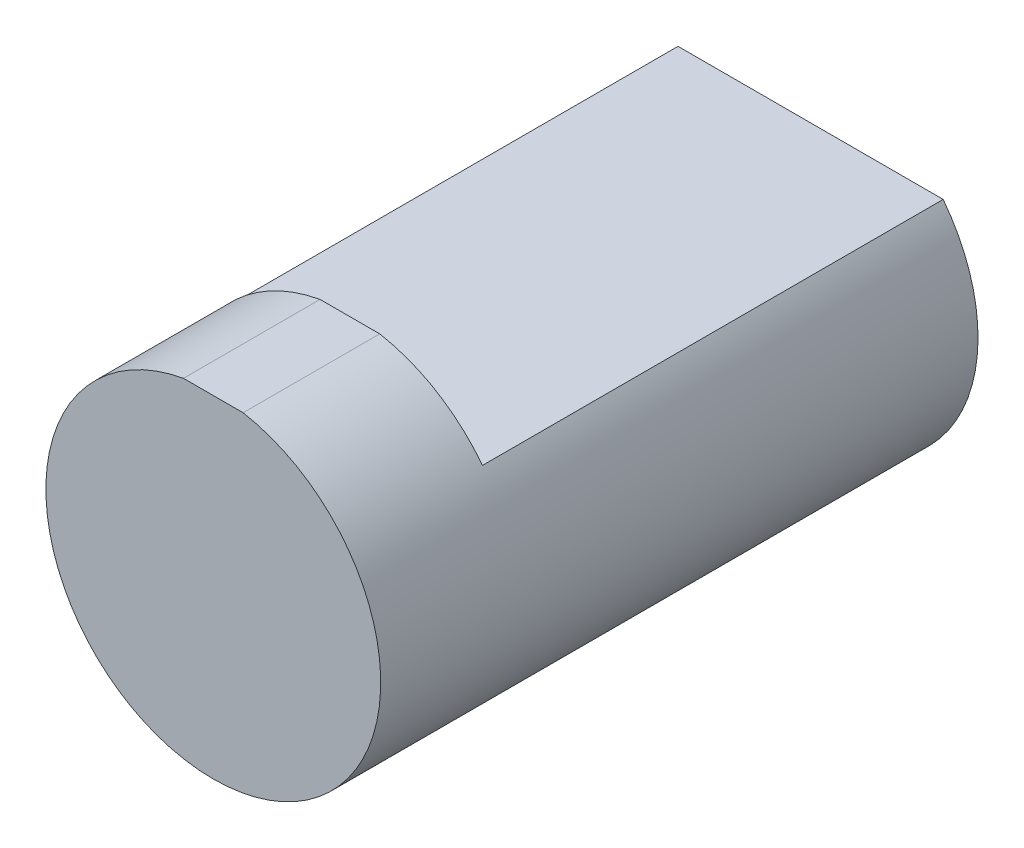
ISO-10303-21;
HEADER;
FILE_DESCRIPTION(('STEP AP214'),'2;1');
FILE_NAME('part.step','',(''),(''),'','','');
FILE_SCHEMA(('AUTOMOTIVE_DESIGN { 1 0 10303 214 1 1 1 1 }'));
ENDSEC;
DATA;
#1=APPLICATION_CONTEXT('core data for automotive mechanical design processes');
#2=APPLICATION_PROTOCOL_DEFINITION('international standard','automotive_design',2000,#1);
#3=PRODUCT_CONTEXT('',#1,'mechanical');
#4=PRODUCT('Part','Part','',(#3));
#5=PRODUCT_RELATED_PRODUCT_CATEGORY('part','',(#4));
#6=PRODUCT_DEFINITION_FORMATION('','',#4);
#7=PRODUCT_DEFINITION_CONTEXT('part definition',#1,'design');
#8=PRODUCT_DEFINITION('design','',#6,#7);
#9=PRODUCT_DEFINITION_SHAPE('','',#8);
#10=(LENGTH_UNIT() NAMED_UNIT(*) SI_UNIT(.MILLI.,.METRE.));
#11=(NAMED_UNIT(*) PLANE_ANGLE_UNIT() SI_UNIT($,.RADIAN.));
#12=(NAMED_UNIT(*) SI_UNIT($,.STERADIAN.) SOLID_ANGLE_UNIT());
#13=UNCERTAINTY_MEASURE_WITH_UNIT(LENGTH_MEASURE(1.E-05),#10,'distance_accuracy_value','');
#14=(GEOMETRIC_REPRESENTATION_CONTEXT(3) GLOBAL_UNCERTAINTY_ASSIGNED_CONTEXT((#13)) GLOBAL_UNIT_ASSIGNED_CONTEXT((#10,
#11,#12)) REPRESENTATION_CONTEXT('',''));
#15=CARTESIAN_POINT('',(0.,0.,0.));
#16=DIRECTION('',(0.,0.,1.));
#17=DIRECTION('',(1.,0.,0.));
#18=AXIS2_PLACEMENT_3D('',#15,#16,#17);
#19=CARTESIAN_POINT('',(0.,0.,223.));
#20=DIRECTION('',(0.,0.,-1.));
#21=DIRECTION('',(-1.,0.,0.));
#22=AXIS2_PLACEMENT_3D('',#19,#20,#21);
#23=CYLINDRICAL_SURFACE('',#22,62.5);
#24=DIRECTION('',(0.,0.,-1.));
#25=VECTOR('',#24,1.);
#26=CARTESIAN_POINT('',(11.1355287256601,61.5,223.));
#27=LINE('',#26,#25);
#28=CARTESIAN_POINT('',(11.1355287256601,61.5,223.));
#29=VERTEX_POINT('',#28);
#30=CARTESIAN_POINT('',(11.13552872566,61.5,172.));
#31=VERTEX_POINT('',#30);
#32=EDGE_CURVE('E52',#29,#31,#27,.T.);
#33=ORIENTED_EDGE('',*,*,#32,.F.);
#34=CARTESIAN_POINT('',(0.,0.,223.));
#35=DIRECTION('',(0.,0.,1.));
#36=DIRECTION('',(1.,0.,0.));
#37=AXIS2_PLACEMENT_3D('',#34,#35,#36);
#38=CIRCLE('',#37,62.5);
#39=CARTESIAN_POINT('',(-11.1355287256601,61.5,223.));
#40=VERTEX_POINT('',#39);
#41=EDGE_CURVE('E46',#40,#29,#38,.T.);
#42=ORIENTED_EDGE('',*,*,#41,.F.);
#43=DIRECTION('',(0.,0.,-1.));
#44=VECTOR('',#43,1.);
#45=CARTESIAN_POINT('',(-11.1355287256601,61.5,223.));
#46=LINE('',#45,#44);
#47=CARTESIAN_POINT('',(-11.13552872566,61.5,172.));
#48=VERTEX_POINT('',#47);
#49=EDGE_CURVE('E78',#48,#40,#46,.F.);
#50=ORIENTED_EDGE('',*,*,#49,.F.);
#51=CARTESIAN_POINT('',(0.,0.,172.));
#52=DIRECTION('',(0.,0.,1.));
#53=DIRECTION('',(1.,0.,0.));
#54=AXIS2_PLACEMENT_3D('',#51,#52,#53);
#55=CIRCLE('',#54,62.5);
#56=CARTESIAN_POINT('',(-49.5,38.1575680566778,172.));
#57=VERTEX_POINT('',#56);
#58=EDGE_CURVE('E60',#48,#57,#55,.T.);
#59=ORIENTED_EDGE('',*,*,#58,.T.);
#60=DIRECTION('',(0.,0.,1.));
#61=VECTOR('',#60,1.);
#62=CARTESIAN_POINT('',(-49.5,38.1575680566778,-634.460117230309));
#63=LINE('',#62,#61);
#64=CARTESIAN_POINT('',(-49.5,38.1575680566778,0.));
#65=VERTEX_POINT('',#64);
#66=EDGE_CURVE('E102',#65,#57,#63,.T.);
#67=ORIENTED_EDGE('',*,*,#66,.F.);
#68=CARTESIAN_POINT('',(0.,0.,0.));
#69=DIRECTION('',(0.,0.,1.));
#70=DIRECTION('',(1.,0.,0.));
#71=AXIS2_PLACEMENT_3D('',#68,#69,#70);
#72=CIRCLE('',#71,62.5);
#73=CARTESIAN_POINT('',(49.5,38.1575680566778,0.));
#74=VERTEX_POINT('',#73);
#75=EDGE_CURVE('E98',#65,#74,#72,.T.);
#76=ORIENTED_EDGE('',*,*,#75,.T.);
#77=DIRECTION('',(0.,0.,1.));
#78=VECTOR('',#77,1.);
#79=CARTESIAN_POINT('',(49.5,38.1575680566778,-634.460117230309));
#80=LINE('',#79,#78);
#81=CARTESIAN_POINT('',(49.5,38.1575680566778,172.));
#82=VERTEX_POINT('',#81);
#83=EDGE_CURVE('E96',#74,#82,#80,.T.);
#84=ORIENTED_EDGE('',*,*,#83,.T.);
#85=EDGE_CURVE('E90',#82,#31,#55,.T.);
#86=ORIENTED_EDGE('',*,*,#85,.T.);
#87=EDGE_LOOP('',(#33,#42,#50,#59,#67,#76,#84,#86));
#88=FACE_BOUND('',#87,.T.);
#89=ADVANCED_FACE('F39',(#88),#23,.T.);
#90=CARTESIAN_POINT('',(0.,0.,223.));
#91=DIRECTION('',(0.,0.,1.));
#92=DIRECTION('',(1.,0.,0.));
#93=AXIS2_PLACEMENT_3D('',#90,#91,#92);
#94=PLANE('',#93);
#95=ORIENTED_EDGE('',*,*,#41,.T.);
#96=DIRECTION('',(-1.,0.,0.));
#97=VECTOR('',#96,1.);
#98=CARTESIAN_POINT('',(111.5,61.5,223.));
#99=LINE('',#98,#97);
#100=EDGE_CURVE('E84',#29,#40,#99,.T.);
#101=ORIENTED_EDGE('',*,*,#100,.T.);
#102=EDGE_LOOP('',(#95,#101));
#103=FACE_BOUND('',#102,.T.);
#104=ADVANCED_FACE('F109',(#103),#94,.T.);
#105=CARTESIAN_POINT('',(0.,0.,172.));
#106=DIRECTION('',(0.,0.,1.));
#107=DIRECTION('',(1.,0.,0.));
#108=AXIS2_PLACEMENT_3D('',#105,#106,#107);
#109=PLANE('',#108);
#110=DIRECTION('',(-1.,0.,0.));
#111=VECTOR('',#110,1.);
#112=CARTESIAN_POINT('',(0.,61.5,172.));
#113=LINE('',#112,#111);
#114=EDGE_CURVE('E11',#31,#48,#113,.T.);
#115=ORIENTED_EDGE('',*,*,#114,.F.);
#116=ORIENTED_EDGE('',*,*,#85,.F.);
#117=DIRECTION('',(1.,0.,0.));
#118=VECTOR('',#117,1.);
#119=CARTESIAN_POINT('',(49.5,38.1575680566778,172.));
#120=LINE('',#119,#118);
#121=EDGE_CURVE('E89',#57,#82,#120,.T.);
#122=ORIENTED_EDGE('',*,*,#121,.F.);
#123=ORIENTED_EDGE('',*,*,#58,.F.);
#124=EDGE_LOOP('',(#115,#116,#122,#123));
#125=FACE_BOUND('',#124,.T.);
#126=ADVANCED_FACE('F87',(#125),#109,.F.);
#127=CARTESIAN_POINT('',(0.,0.,0.));
#128=DIRECTION('',(0.,0.,1.));
#129=DIRECTION('',(1.,0.,0.));
#130=AXIS2_PLACEMENT_3D('',#127,#128,#129);
#131=PLANE('',#130);
#132=ORIENTED_EDGE('',*,*,#75,.F.);
#133=DIRECTION('',(1.,0.,0.));
#134=VECTOR('',#133,1.);
#135=CARTESIAN_POINT('',(49.5,38.1575680566778,0.));
#136=LINE('',#135,#134);
#137=EDGE_CURVE('E92',#65,#74,#136,.T.);
#138=ORIENTED_EDGE('',*,*,#137,.T.);
#139=EDGE_LOOP('',(#132,#138));
#140=FACE_BOUND('',#139,.T.);
#141=ADVANCED_FACE('F112',(#140),#131,.F.);
#142=CARTESIAN_POINT('',(49.5,38.1575680566778,-634.460117230309));
#143=DIRECTION('',(0.,1.,0.));
#144=DIRECTION('',(0.,0.,1.));
#145=AXIS2_PLACEMENT_3D('',#142,#143,#144);
#146=PLANE('',#145);
#147=ORIENTED_EDGE('',*,*,#137,.F.);
#148=ORIENTED_EDGE('',*,*,#66,.T.);
#149=ORIENTED_EDGE('',*,*,#121,.T.);
#150=ORIENTED_EDGE('',*,*,#83,.F.);
#151=EDGE_LOOP('',(#147,#148,#149,#150));
#152=FACE_BOUND('',#151,.T.);
#153=ADVANCED_FACE('F110',(#152),#146,.T.);
#154=CARTESIAN_POINT('',(111.5,61.5,172.));
#155=DIRECTION('',(0.,1.,0.));
#156=DIRECTION('',(0.,0.,1.));
#157=AXIS2_PLACEMENT_3D('',#154,#155,#156);
#158=PLANE('',#157);
#159=ORIENTED_EDGE('',*,*,#32,.T.);
#160=ORIENTED_EDGE('',*,*,#114,.T.);
#161=ORIENTED_EDGE('',*,*,#49,.T.);
#162=ORIENTED_EDGE('',*,*,#100,.F.);
#163=EDGE_LOOP('',(#159,#160,#161,#162));
#164=FACE_BOUND('',#163,.T.);
#165=ADVANCED_FACE('F77',(#164),#158,.T.);
#166=CLOSED_SHELL('',(#89,#104,#126,#141,#153,#165));
#167=MANIFOLD_SOLID_BREP('B2',#166);
#168=ADVANCED_BREP_SHAPE_REPRESENTATION('',(#18,#167),#14);
#169=SHAPE_DEFINITION_REPRESENTATION(#9,#168);
ENDSEC;
END-ISO-10303-21;
